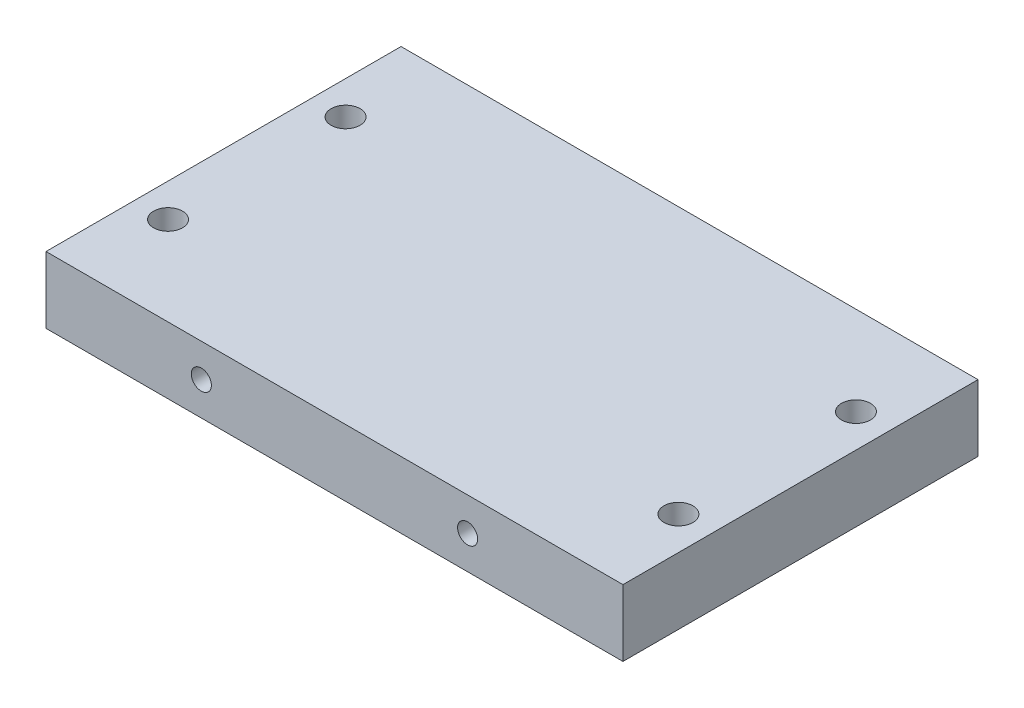
ISO-10303-21;
HEADER;
FILE_DESCRIPTION(('STEP AP214'),'2;1');
FILE_NAME('part.step','',(''),(''),'','','');
FILE_SCHEMA(('AUTOMOTIVE_DESIGN { 1 0 10303 214 1 1 1 1 }'));
ENDSEC;
DATA;
#1=APPLICATION_CONTEXT('core data for automotive mechanical design processes');
#2=APPLICATION_PROTOCOL_DEFINITION('international standard','automotive_design',2000,#1);
#3=PRODUCT_CONTEXT('',#1,'mechanical');
#4=PRODUCT('Part','Part','',(#3));
#5=PRODUCT_RELATED_PRODUCT_CATEGORY('part','',(#4));
#6=PRODUCT_DEFINITION_FORMATION('','',#4);
#7=PRODUCT_DEFINITION_CONTEXT('part definition',#1,'design');
#8=PRODUCT_DEFINITION('design','',#6,#7);
#9=PRODUCT_DEFINITION_SHAPE('','',#8);
#10=(LENGTH_UNIT() NAMED_UNIT(*) SI_UNIT(.MILLI.,.METRE.));
#11=(NAMED_UNIT(*) PLANE_ANGLE_UNIT() SI_UNIT($,.RADIAN.));
#12=(NAMED_UNIT(*) SI_UNIT($,.STERADIAN.) SOLID_ANGLE_UNIT());
#13=UNCERTAINTY_MEASURE_WITH_UNIT(LENGTH_MEASURE(1.E-05),#10,'distance_accuracy_value','');
#14=(GEOMETRIC_REPRESENTATION_CONTEXT(3) GLOBAL_UNCERTAINTY_ASSIGNED_CONTEXT((#13)) GLOBAL_UNIT_ASSIGNED_CONTEXT((#10,
#11,#12)) REPRESENTATION_CONTEXT('',''));
#15=CARTESIAN_POINT('',(0.,0.,0.));
#16=DIRECTION('',(0.,0.,1.));
#17=DIRECTION('',(1.,0.,0.));
#18=AXIS2_PLACEMENT_3D('',#15,#16,#17);
#19=CARTESIAN_POINT('',(-32.5,7.5,20.));
#20=DIRECTION('',(1.,0.,0.));
#21=DIRECTION('',(0.,0.,-1.));
#22=AXIS2_PLACEMENT_3D('',#19,#20,#21);
#23=PLANE('',#22);
#24=DIRECTION('',(0.,0.,1.));
#25=VECTOR('',#24,1.);
#26=CARTESIAN_POINT('',(-32.5,0.,20.));
#27=LINE('',#26,#25);
#28=CARTESIAN_POINT('',(-32.5,0.,-20.));
#29=VERTEX_POINT('',#28);
#30=CARTESIAN_POINT('',(-32.5,0.,20.));
#31=VERTEX_POINT('',#30);
#32=EDGE_CURVE('E135',#29,#31,#27,.T.);
#33=ORIENTED_EDGE('',*,*,#32,.T.);
#34=DIRECTION('',(0.,-1.,0.));
#35=VECTOR('',#34,1.);
#36=CARTESIAN_POINT('',(-32.5,7.5,20.));
#37=LINE('',#36,#35);
#38=CARTESIAN_POINT('',(-32.5,7.5,20.));
#39=VERTEX_POINT('',#38);
#40=EDGE_CURVE('E11',#39,#31,#37,.T.);
#41=ORIENTED_EDGE('',*,*,#40,.F.);
#42=DIRECTION('',(0.,0.,1.));
#43=VECTOR('',#42,1.);
#44=CARTESIAN_POINT('',(-32.5,7.5,20.));
#45=LINE('',#44,#43);
#46=CARTESIAN_POINT('',(-32.5,7.5,-20.));
#47=VERTEX_POINT('',#46);
#48=EDGE_CURVE('E136',#47,#39,#45,.T.);
#49=ORIENTED_EDGE('',*,*,#48,.F.);
#50=DIRECTION('',(0.,-1.,0.));
#51=VECTOR('',#50,1.);
#52=CARTESIAN_POINT('',(-32.5,7.5,-20.));
#53=LINE('',#52,#51);
#54=EDGE_CURVE('E142',#47,#29,#53,.T.);
#55=ORIENTED_EDGE('',*,*,#54,.T.);
#56=EDGE_LOOP('',(#33,#41,#49,#55));
#57=FACE_BOUND('',#56,.T.);
#58=ADVANCED_FACE('F40',(#57),#23,.F.);
#59=CARTESIAN_POINT('',(32.5,7.5,20.));
#60=DIRECTION('',(0.,0.,-1.));
#61=DIRECTION('',(-1.,0.,0.));
#62=AXIS2_PLACEMENT_3D('',#59,#60,#61);
#63=PLANE('',#62);
#64=CARTESIAN_POINT('',(-15.,3.75,20.));
#65=DIRECTION('',(0.,0.,1.));
#66=DIRECTION('',(1.,0.,0.));
#67=AXIS2_PLACEMENT_3D('',#64,#65,#66);
#68=CIRCLE('',#67,1.13029999999999);
#69=CARTESIAN_POINT('',(-13.8697,3.75,20.));
#70=VERTEX_POINT('',#69);
#71=EDGE_CURVE('E123',#70,#70,#68,.T.);
#72=ORIENTED_EDGE('',*,*,#71,.F.);
#73=EDGE_LOOP('',(#72));
#74=FACE_BOUND('',#73,.T.);
#75=CARTESIAN_POINT('',(15.,3.75,20.));
#76=DIRECTION('',(0.,0.,1.));
#77=DIRECTION('',(1.,0.,0.));
#78=AXIS2_PLACEMENT_3D('',#75,#76,#77);
#79=CIRCLE('',#78,1.13029999999999);
#80=CARTESIAN_POINT('',(16.1303,3.75,20.));
#81=VERTEX_POINT('',#80);
#82=EDGE_CURVE('E129',#81,#81,#79,.T.);
#83=ORIENTED_EDGE('',*,*,#82,.F.);
#84=EDGE_LOOP('',(#83));
#85=FACE_BOUND('',#84,.T.);
#86=DIRECTION('',(1.,0.,0.));
#87=VECTOR('',#86,1.);
#88=CARTESIAN_POINT('',(32.5,0.,20.));
#89=LINE('',#88,#87);
#90=CARTESIAN_POINT('',(32.5,0.,20.));
#91=VERTEX_POINT('',#90);
#92=EDGE_CURVE('E145',#31,#91,#89,.T.);
#93=ORIENTED_EDGE('',*,*,#92,.T.);
#94=DIRECTION('',(0.,-1.,0.));
#95=VECTOR('',#94,1.);
#96=CARTESIAN_POINT('',(32.5,7.5,20.));
#97=LINE('',#96,#95);
#98=CARTESIAN_POINT('',(32.5,7.5,20.));
#99=VERTEX_POINT('',#98);
#100=EDGE_CURVE('E48',#99,#91,#97,.T.);
#101=ORIENTED_EDGE('',*,*,#100,.F.);
#102=DIRECTION('',(1.,0.,0.));
#103=VECTOR('',#102,1.);
#104=CARTESIAN_POINT('',(32.5,7.5,20.));
#105=LINE('',#104,#103);
#106=EDGE_CURVE('E87',#39,#99,#105,.T.);
#107=ORIENTED_EDGE('',*,*,#106,.F.);
#108=ORIENTED_EDGE('',*,*,#40,.T.);
#109=EDGE_LOOP('',(#93,#101,#107,#108));
#110=FACE_BOUND('',#109,.T.);
#111=ADVANCED_FACE('F170',(#74,#85,#110),#63,.F.);
#112=CARTESIAN_POINT('',(32.5,7.5,20.));
#113=DIRECTION('',(-1.,0.,0.));
#114=DIRECTION('',(0.,0.,1.));
#115=AXIS2_PLACEMENT_3D('',#112,#113,#114);
#116=PLANE('',#115);
#117=DIRECTION('',(0.,0.,-1.));
#118=VECTOR('',#117,1.);
#119=CARTESIAN_POINT('',(32.5,0.,20.));
#120=LINE('',#119,#118);
#121=CARTESIAN_POINT('',(32.5,0.,-20.));
#122=VERTEX_POINT('',#121);
#123=EDGE_CURVE('E74',#91,#122,#120,.T.);
#124=ORIENTED_EDGE('',*,*,#123,.T.);
#125=DIRECTION('',(0.,-1.,0.));
#126=VECTOR('',#125,1.);
#127=CARTESIAN_POINT('',(32.5,7.5,-20.));
#128=LINE('',#127,#126);
#129=CARTESIAN_POINT('',(32.5,7.5,-20.));
#130=VERTEX_POINT('',#129);
#131=EDGE_CURVE('E150',#130,#122,#128,.T.);
#132=ORIENTED_EDGE('',*,*,#131,.F.);
#133=DIRECTION('',(0.,0.,-1.));
#134=VECTOR('',#133,1.);
#135=CARTESIAN_POINT('',(32.5,7.5,20.));
#136=LINE('',#135,#134);
#137=EDGE_CURVE('E139',#99,#130,#136,.T.);
#138=ORIENTED_EDGE('',*,*,#137,.F.);
#139=ORIENTED_EDGE('',*,*,#100,.T.);
#140=EDGE_LOOP('',(#124,#132,#138,#139));
#141=FACE_BOUND('',#140,.T.);
#142=ADVANCED_FACE('F152',(#141),#116,.F.);
#143=CARTESIAN_POINT('',(32.5,7.5,-20.));
#144=DIRECTION('',(0.,0.,1.));
#145=DIRECTION('',(1.,0.,0.));
#146=AXIS2_PLACEMENT_3D('',#143,#144,#145);
#147=PLANE('',#146);
#148=CARTESIAN_POINT('',(15.,3.75,-20.));
#149=DIRECTION('',(0.,0.,-1.));
#150=DIRECTION('',(-1.,0.,0.));
#151=AXIS2_PLACEMENT_3D('',#148,#149,#150);
#152=CIRCLE('',#151,1.13029999999999);
#153=CARTESIAN_POINT('',(13.8697,3.75,-20.));
#154=VERTEX_POINT('',#153);
#155=EDGE_CURVE('E111',#154,#154,#152,.T.);
#156=ORIENTED_EDGE('',*,*,#155,.F.);
#157=EDGE_LOOP('',(#156));
#158=FACE_BOUND('',#157,.T.);
#159=CARTESIAN_POINT('',(-15.,3.75,-20.));
#160=DIRECTION('',(0.,0.,-1.));
#161=DIRECTION('',(-1.,0.,0.));
#162=AXIS2_PLACEMENT_3D('',#159,#160,#161);
#163=CIRCLE('',#162,1.13029999999999);
#164=CARTESIAN_POINT('',(-16.1303,3.75,-20.));
#165=VERTEX_POINT('',#164);
#166=EDGE_CURVE('E110',#165,#165,#163,.T.);
#167=ORIENTED_EDGE('',*,*,#166,.F.);
#168=EDGE_LOOP('',(#167));
#169=FACE_BOUND('',#168,.T.);
#170=DIRECTION('',(-1.,0.,0.));
#171=VECTOR('',#170,1.);
#172=CARTESIAN_POINT('',(32.5,0.,-20.));
#173=LINE('',#172,#171);
#174=EDGE_CURVE('E80',#122,#29,#173,.T.);
#175=ORIENTED_EDGE('',*,*,#174,.T.);
#176=ORIENTED_EDGE('',*,*,#54,.F.);
#177=DIRECTION('',(-1.,0.,0.));
#178=VECTOR('',#177,1.);
#179=CARTESIAN_POINT('',(32.5,7.5,-20.));
#180=LINE('',#179,#178);
#181=EDGE_CURVE('E56',#130,#47,#180,.T.);
#182=ORIENTED_EDGE('',*,*,#181,.F.);
#183=ORIENTED_EDGE('',*,*,#131,.T.);
#184=EDGE_LOOP('',(#175,#176,#182,#183));
#185=FACE_BOUND('',#184,.T.);
#186=ADVANCED_FACE('F159',(#158,#169,#185),#147,.F.);
#187=CARTESIAN_POINT('',(0.,7.5,0.));
#188=DIRECTION('',(0.,1.,0.));
#189=DIRECTION('',(0.,0.,1.));
#190=AXIS2_PLACEMENT_3D('',#187,#188,#189);
#191=PLANE('',#190);
#192=CARTESIAN_POINT('',(28.75,7.5,9.99999999999999));
#193=DIRECTION('',(0.,-1.,0.));
#194=DIRECTION('',(0.,0.,-1.));
#195=AXIS2_PLACEMENT_3D('',#192,#193,#194);
#196=CIRCLE('',#195,1.63195);
#197=CARTESIAN_POINT('',(28.75,7.5,8.36805));
#198=VERTEX_POINT('',#197);
#199=EDGE_CURVE('E409',#198,#198,#196,.T.);
#200=ORIENTED_EDGE('',*,*,#199,.T.);
#201=EDGE_LOOP('',(#200));
#202=FACE_BOUND('',#201,.T.);
#203=CARTESIAN_POINT('',(28.75,7.5,-10.));
#204=DIRECTION('',(0.,-1.,0.));
#205=DIRECTION('',(0.,0.,-1.));
#206=AXIS2_PLACEMENT_3D('',#203,#204,#205);
#207=CIRCLE('',#206,1.63195);
#208=CARTESIAN_POINT('',(28.75,7.5,-11.63195));
#209=VERTEX_POINT('',#208);
#210=EDGE_CURVE('E419',#209,#209,#207,.T.);
#211=ORIENTED_EDGE('',*,*,#210,.T.);
#212=EDGE_LOOP('',(#211));
#213=FACE_BOUND('',#212,.T.);
#214=CARTESIAN_POINT('',(-28.75,7.5,-10.));
#215=DIRECTION('',(0.,-1.,0.));
#216=DIRECTION('',(0.,0.,-1.));
#217=AXIS2_PLACEMENT_3D('',#214,#215,#216);
#218=CIRCLE('',#217,1.63195);
#219=CARTESIAN_POINT('',(-28.75,7.5,-11.63195));
#220=VERTEX_POINT('',#219);
#221=EDGE_CURVE('E224',#220,#220,#218,.T.);
#222=ORIENTED_EDGE('',*,*,#221,.T.);
#223=EDGE_LOOP('',(#222));
#224=FACE_BOUND('',#223,.T.);
#225=CARTESIAN_POINT('',(-28.75,7.5,10.));
#226=DIRECTION('',(0.,-1.,0.));
#227=DIRECTION('',(0.,0.,-1.));
#228=AXIS2_PLACEMENT_3D('',#225,#226,#227);
#229=CIRCLE('',#228,1.63195);
#230=CARTESIAN_POINT('',(-28.75,7.5,8.36805000000001));
#231=VERTEX_POINT('',#230);
#232=EDGE_CURVE('E117',#231,#231,#229,.T.);
#233=ORIENTED_EDGE('',*,*,#232,.T.);
#234=EDGE_LOOP('',(#233));
#235=FACE_BOUND('',#234,.T.);
#236=ORIENTED_EDGE('',*,*,#48,.T.);
#237=ORIENTED_EDGE('',*,*,#106,.T.);
#238=ORIENTED_EDGE('',*,*,#137,.T.);
#239=ORIENTED_EDGE('',*,*,#181,.T.);
#240=EDGE_LOOP('',(#236,#237,#238,#239));
#241=FACE_BOUND('',#240,.T.);
#242=ADVANCED_FACE('F161',(#202,#213,#224,#235,#241),#191,.T.);
#243=CARTESIAN_POINT('',(0.,0.,0.));
#244=DIRECTION('',(0.,1.,0.));
#245=DIRECTION('',(0.,0.,1.));
#246=AXIS2_PLACEMENT_3D('',#243,#244,#245);
#247=PLANE('',#246);
#248=CARTESIAN_POINT('',(28.75,0.,9.99999999999999));
#249=DIRECTION('',(0.,-1.,0.));
#250=DIRECTION('',(0.,0.,-1.));
#251=AXIS2_PLACEMENT_3D('',#248,#249,#250);
#252=CIRCLE('',#251,2.77876);
#253=CARTESIAN_POINT('',(28.75,0.,7.22124));
#254=VERTEX_POINT('',#253);
#255=EDGE_CURVE('E210',#254,#254,#252,.T.);
#256=ORIENTED_EDGE('',*,*,#255,.F.);
#257=EDGE_LOOP('',(#256));
#258=FACE_BOUND('',#257,.T.);
#259=CARTESIAN_POINT('',(28.75,0.,-10.));
#260=DIRECTION('',(0.,-1.,0.));
#261=DIRECTION('',(0.,0.,-1.));
#262=AXIS2_PLACEMENT_3D('',#259,#260,#261);
#263=CIRCLE('',#262,2.77876);
#264=CARTESIAN_POINT('',(28.75,0.,-12.77876));
#265=VERTEX_POINT('',#264);
#266=EDGE_CURVE('E214',#265,#265,#263,.T.);
#267=ORIENTED_EDGE('',*,*,#266,.F.);
#268=EDGE_LOOP('',(#267));
#269=FACE_BOUND('',#268,.T.);
#270=CARTESIAN_POINT('',(-28.75,0.,-10.));
#271=DIRECTION('',(0.,-1.,0.));
#272=DIRECTION('',(0.,0.,-1.));
#273=AXIS2_PLACEMENT_3D('',#270,#271,#272);
#274=CIRCLE('',#273,2.77876);
#275=CARTESIAN_POINT('',(-28.75,0.,-12.77876));
#276=VERTEX_POINT('',#275);
#277=EDGE_CURVE('E218',#276,#276,#274,.T.);
#278=ORIENTED_EDGE('',*,*,#277,.F.);
#279=EDGE_LOOP('',(#278));
#280=FACE_BOUND('',#279,.T.);
#281=CARTESIAN_POINT('',(-28.75,0.,10.));
#282=DIRECTION('',(0.,-1.,0.));
#283=DIRECTION('',(0.,0.,-1.));
#284=AXIS2_PLACEMENT_3D('',#281,#282,#283);
#285=CIRCLE('',#284,2.77876);
#286=CARTESIAN_POINT('',(-28.75,0.,7.22124));
#287=VERTEX_POINT('',#286);
#288=EDGE_CURVE('E221',#287,#287,#285,.T.);
#289=ORIENTED_EDGE('',*,*,#288,.F.);
#290=EDGE_LOOP('',(#289));
#291=FACE_BOUND('',#290,.T.);
#292=ORIENTED_EDGE('',*,*,#32,.F.);
#293=ORIENTED_EDGE('',*,*,#174,.F.);
#294=ORIENTED_EDGE('',*,*,#123,.F.);
#295=ORIENTED_EDGE('',*,*,#92,.F.);
#296=EDGE_LOOP('',(#292,#293,#294,#295));
#297=FACE_BOUND('',#296,.T.);
#298=ADVANCED_FACE('F155',(#258,#269,#280,#291,#297),#247,.F.);
#299=CARTESIAN_POINT('',(15.,3.75,12.4));
#300=DIRECTION('',(0.,0.,1.));
#301=DIRECTION('',(1.,0.,0.));
#302=AXIS2_PLACEMENT_3D('',#299,#300,#301);
#303=CONICAL_SURFACE('',#302,1.13029999999999,1.02974425867665);
#304=CARTESIAN_POINT('',(15.,3.75,11.7208472423132));
#305=VERTEX_POINT('',#304);
#306=VERTEX_LOOP('',#305);
#307=FACE_BOUND('',#306,.T.);
#308=CARTESIAN_POINT('',(15.,3.75,12.4));
#309=DIRECTION('',(0.,0.,1.));
#310=DIRECTION('',(1.,0.,0.));
#311=AXIS2_PLACEMENT_3D('',#308,#309,#310);
#312=CIRCLE('',#311,1.13029999999999);
#313=CARTESIAN_POINT('',(16.1303,3.75,12.4));
#314=VERTEX_POINT('',#313);
#315=EDGE_CURVE('E132',#314,#314,#312,.T.);
#316=ORIENTED_EDGE('',*,*,#315,.T.);
#317=EDGE_LOOP('',(#316));
#318=FACE_BOUND('',#317,.T.);
#319=ADVANCED_FACE('F189',(#307,#318),#303,.F.);
#320=CARTESIAN_POINT('',(15.,3.75,20.));
#321=DIRECTION('',(0.,0.,1.));
#322=DIRECTION('',(1.,0.,0.));
#323=AXIS2_PLACEMENT_3D('',#320,#321,#322);
#324=CYLINDRICAL_SURFACE('',#323,1.13029999999999);
#325=ORIENTED_EDGE('',*,*,#315,.F.);
#326=EDGE_LOOP('',(#325));
#327=FACE_BOUND('',#326,.T.);
#328=ORIENTED_EDGE('',*,*,#82,.T.);
#329=EDGE_LOOP('',(#328));
#330=FACE_BOUND('',#329,.T.);
#331=ADVANCED_FACE('F186',(#327,#330),#324,.F.);
#332=CARTESIAN_POINT('',(-15.,3.75,12.4));
#333=DIRECTION('',(0.,0.,1.));
#334=DIRECTION('',(1.,0.,0.));
#335=AXIS2_PLACEMENT_3D('',#332,#333,#334);
#336=CONICAL_SURFACE('',#335,1.13029999999999,1.02974425867665);
#337=CARTESIAN_POINT('',(-15.,3.75,11.7208472423132));
#338=VERTEX_POINT('',#337);
#339=VERTEX_LOOP('',#338);
#340=FACE_BOUND('',#339,.T.);
#341=CARTESIAN_POINT('',(-15.,3.75,12.4));
#342=DIRECTION('',(0.,0.,1.));
#343=DIRECTION('',(1.,0.,0.));
#344=AXIS2_PLACEMENT_3D('',#341,#342,#343);
#345=CIRCLE('',#344,1.13029999999999);
#346=CARTESIAN_POINT('',(-13.8697,3.75,12.4));
#347=VERTEX_POINT('',#346);
#348=EDGE_CURVE('E126',#347,#347,#345,.T.);
#349=ORIENTED_EDGE('',*,*,#348,.T.);
#350=EDGE_LOOP('',(#349));
#351=FACE_BOUND('',#350,.T.);
#352=ADVANCED_FACE('F188',(#340,#351),#336,.F.);
#353=CARTESIAN_POINT('',(-15.,3.75,20.));
#354=DIRECTION('',(0.,0.,1.));
#355=DIRECTION('',(1.,0.,0.));
#356=AXIS2_PLACEMENT_3D('',#353,#354,#355);
#357=CYLINDRICAL_SURFACE('',#356,1.13029999999999);
#358=ORIENTED_EDGE('',*,*,#348,.F.);
#359=EDGE_LOOP('',(#358));
#360=FACE_BOUND('',#359,.T.);
#361=ORIENTED_EDGE('',*,*,#71,.T.);
#362=EDGE_LOOP('',(#361));
#363=FACE_BOUND('',#362,.T.);
#364=ADVANCED_FACE('F196',(#360,#363),#357,.F.);
#365=CARTESIAN_POINT('',(-15.,3.75,-12.4));
#366=DIRECTION('',(0.,0.,-1.));
#367=DIRECTION('',(-1.,0.,0.));
#368=AXIS2_PLACEMENT_3D('',#365,#366,#367);
#369=CONICAL_SURFACE('',#368,1.13029999999999,1.02974425867665);
#370=CARTESIAN_POINT('',(-15.,3.75,-11.7208472423132));
#371=VERTEX_POINT('',#370);
#372=VERTEX_LOOP('',#371);
#373=FACE_BOUND('',#372,.T.);
#374=CARTESIAN_POINT('',(-15.,3.75,-12.4));
#375=DIRECTION('',(0.,0.,-1.));
#376=DIRECTION('',(-1.,0.,0.));
#377=AXIS2_PLACEMENT_3D('',#374,#375,#376);
#378=CIRCLE('',#377,1.13029999999999);
#379=CARTESIAN_POINT('',(-16.1303,3.75,-12.4));
#380=VERTEX_POINT('',#379);
#381=EDGE_CURVE('E114',#380,#380,#378,.T.);
#382=ORIENTED_EDGE('',*,*,#381,.T.);
#383=EDGE_LOOP('',(#382));
#384=FACE_BOUND('',#383,.T.);
#385=ADVANCED_FACE('F267',(#373,#384),#369,.F.);
#386=CARTESIAN_POINT('',(-15.,3.75,-20.));
#387=DIRECTION('',(0.,0.,-1.));
#388=DIRECTION('',(-1.,0.,0.));
#389=AXIS2_PLACEMENT_3D('',#386,#387,#388);
#390=CYLINDRICAL_SURFACE('',#389,1.13029999999999);
#391=ORIENTED_EDGE('',*,*,#381,.F.);
#392=EDGE_LOOP('',(#391));
#393=FACE_BOUND('',#392,.T.);
#394=ORIENTED_EDGE('',*,*,#166,.T.);
#395=EDGE_LOOP('',(#394));
#396=FACE_BOUND('',#395,.T.);
#397=ADVANCED_FACE('F104',(#393,#396),#390,.F.);
#398=CARTESIAN_POINT('',(15.,3.75,-12.4));
#399=DIRECTION('',(0.,0.,-1.));
#400=DIRECTION('',(-1.,0.,0.));
#401=AXIS2_PLACEMENT_3D('',#398,#399,#400);
#402=CONICAL_SURFACE('',#401,1.13029999999999,1.02974425867665);
#403=CARTESIAN_POINT('',(15.,3.75,-11.7208472423132));
#404=VERTEX_POINT('',#403);
#405=VERTEX_LOOP('',#404);
#406=FACE_BOUND('',#405,.T.);
#407=CARTESIAN_POINT('',(15.,3.75,-12.4));
#408=DIRECTION('',(0.,0.,-1.));
#409=DIRECTION('',(-1.,0.,0.));
#410=AXIS2_PLACEMENT_3D('',#407,#408,#409);
#411=CIRCLE('',#410,1.13029999999999);
#412=CARTESIAN_POINT('',(13.8697,3.75,-12.4));
#413=VERTEX_POINT('',#412);
#414=EDGE_CURVE('E108',#413,#413,#411,.T.);
#415=ORIENTED_EDGE('',*,*,#414,.T.);
#416=EDGE_LOOP('',(#415));
#417=FACE_BOUND('',#416,.T.);
#418=ADVANCED_FACE('F100',(#406,#417),#402,.F.);
#419=CARTESIAN_POINT('',(15.,3.75,-20.));
#420=DIRECTION('',(0.,0.,-1.));
#421=DIRECTION('',(-1.,0.,0.));
#422=AXIS2_PLACEMENT_3D('',#419,#420,#421);
#423=CYLINDRICAL_SURFACE('',#422,1.13029999999999);
#424=ORIENTED_EDGE('',*,*,#414,.F.);
#425=EDGE_LOOP('',(#424));
#426=FACE_BOUND('',#425,.T.);
#427=ORIENTED_EDGE('',*,*,#155,.T.);
#428=EDGE_LOOP('',(#427));
#429=FACE_BOUND('',#428,.T.);
#430=ADVANCED_FACE('F103',(#426,#429),#423,.F.);
#431=CARTESIAN_POINT('',(-28.75,0.,10.));
#432=DIRECTION('',(0.,-1.,0.));
#433=DIRECTION('',(0.,0.,-1.));
#434=AXIS2_PLACEMENT_3D('',#431,#432,#433);
#435=CYLINDRICAL_SURFACE('',#434,1.63195);
#436=ORIENTED_EDGE('',*,*,#232,.F.);
#437=EDGE_LOOP('',(#436));
#438=FACE_BOUND('',#437,.T.);
#439=CARTESIAN_POINT('',(-28.75,2.8448,10.));
#440=DIRECTION('',(0.,-1.,0.));
#441=DIRECTION('',(0.,0.,-1.));
#442=AXIS2_PLACEMENT_3D('',#439,#440,#441);
#443=CIRCLE('',#442,1.63195);
#444=CARTESIAN_POINT('',(-28.75,2.8448,8.36805));
#445=VERTEX_POINT('',#444);
#446=EDGE_CURVE('E227',#445,#445,#443,.T.);
#447=ORIENTED_EDGE('',*,*,#446,.T.);
#448=EDGE_LOOP('',(#447));
#449=FACE_BOUND('',#448,.T.);
#450=ADVANCED_FACE('F239',(#438,#449),#435,.F.);
#451=CARTESIAN_POINT('',(-27.11805,2.8448,10.));
#452=DIRECTION('',(0.,1.,0.));
#453=DIRECTION('',(0.,0.,1.));
#454=AXIS2_PLACEMENT_3D('',#451,#452,#453);
#455=PLANE('',#454);
#456=ORIENTED_EDGE('',*,*,#446,.F.);
#457=EDGE_LOOP('',(#456));
#458=FACE_BOUND('',#457,.T.);
#459=CARTESIAN_POINT('',(-28.75,2.8448,10.));
#460=DIRECTION('',(0.,-1.,0.));
#461=DIRECTION('',(0.,0.,-1.));
#462=AXIS2_PLACEMENT_3D('',#459,#460,#461);
#463=CIRCLE('',#462,2.77876);
#464=CARTESIAN_POINT('',(-28.75,2.8448,7.22124));
#465=VERTEX_POINT('',#464);
#466=EDGE_CURVE('E223',#465,#465,#463,.T.);
#467=ORIENTED_EDGE('',*,*,#466,.T.);
#468=EDGE_LOOP('',(#467));
#469=FACE_BOUND('',#468,.T.);
#470=ADVANCED_FACE('F242',(#458,#469),#455,.F.);
#471=CARTESIAN_POINT('',(-28.75,0.,10.));
#472=DIRECTION('',(0.,-1.,0.));
#473=DIRECTION('',(0.,0.,-1.));
#474=AXIS2_PLACEMENT_3D('',#471,#472,#473);
#475=CYLINDRICAL_SURFACE('',#474,2.77876);
#476=ORIENTED_EDGE('',*,*,#466,.F.);
#477=EDGE_LOOP('',(#476));
#478=FACE_BOUND('',#477,.T.);
#479=ORIENTED_EDGE('',*,*,#288,.T.);
#480=EDGE_LOOP('',(#479));
#481=FACE_BOUND('',#480,.T.);
#482=ADVANCED_FACE('F248',(#478,#481),#475,.F.);
#483=CARTESIAN_POINT('',(-28.75,0.,-10.));
#484=DIRECTION('',(0.,-1.,0.));
#485=DIRECTION('',(0.,0.,-1.));
#486=AXIS2_PLACEMENT_3D('',#483,#484,#485);
#487=CYLINDRICAL_SURFACE('',#486,1.63195);
#488=ORIENTED_EDGE('',*,*,#221,.F.);
#489=EDGE_LOOP('',(#488));
#490=FACE_BOUND('',#489,.T.);
#491=CARTESIAN_POINT('',(-28.75,2.8448,-10.));
#492=DIRECTION('',(0.,-1.,0.));
#493=DIRECTION('',(0.,0.,-1.));
#494=AXIS2_PLACEMENT_3D('',#491,#492,#493);
#495=CIRCLE('',#494,1.63195);
#496=CARTESIAN_POINT('',(-28.75,2.8448,-11.63195));
#497=VERTEX_POINT('',#496);
#498=EDGE_CURVE('E230',#497,#497,#495,.T.);
#499=ORIENTED_EDGE('',*,*,#498,.T.);
#500=EDGE_LOOP('',(#499));
#501=FACE_BOUND('',#500,.T.);
#502=ADVANCED_FACE('F253',(#490,#501),#487,.F.);
#503=CARTESIAN_POINT('',(-27.11805,2.8448,-10.));
#504=DIRECTION('',(0.,1.,0.));
#505=DIRECTION('',(0.,0.,1.));
#506=AXIS2_PLACEMENT_3D('',#503,#504,#505);
#507=PLANE('',#506);
#508=ORIENTED_EDGE('',*,*,#498,.F.);
#509=EDGE_LOOP('',(#508));
#510=FACE_BOUND('',#509,.T.);
#511=CARTESIAN_POINT('',(-28.75,2.8448,-10.));
#512=DIRECTION('',(0.,-1.,0.));
#513=DIRECTION('',(0.,0.,-1.));
#514=AXIS2_PLACEMENT_3D('',#511,#512,#513);
#515=CIRCLE('',#514,2.77876);
#516=CARTESIAN_POINT('',(-28.75,2.8448,-12.77876));
#517=VERTEX_POINT('',#516);
#518=EDGE_CURVE('E423',#517,#517,#515,.T.);
#519=ORIENTED_EDGE('',*,*,#518,.T.);
#520=EDGE_LOOP('',(#519));
#521=FACE_BOUND('',#520,.T.);
#522=ADVANCED_FACE('F258',(#510,#521),#507,.F.);
#523=CARTESIAN_POINT('',(-28.75,0.,-10.));
#524=DIRECTION('',(0.,-1.,0.));
#525=DIRECTION('',(0.,0.,-1.));
#526=AXIS2_PLACEMENT_3D('',#523,#524,#525);
#527=CYLINDRICAL_SURFACE('',#526,2.77876);
#528=ORIENTED_EDGE('',*,*,#518,.F.);
#529=EDGE_LOOP('',(#528));
#530=FACE_BOUND('',#529,.T.);
#531=ORIENTED_EDGE('',*,*,#277,.T.);
#532=EDGE_LOOP('',(#531));
#533=FACE_BOUND('',#532,.T.);
#534=ADVANCED_FACE('F326',(#530,#533),#527,.F.);
#535=CARTESIAN_POINT('',(28.75,0.,-10.));
#536=DIRECTION('',(0.,-1.,0.));
#537=DIRECTION('',(0.,0.,-1.));
#538=AXIS2_PLACEMENT_3D('',#535,#536,#537);
#539=CYLINDRICAL_SURFACE('',#538,1.63195);
#540=ORIENTED_EDGE('',*,*,#210,.F.);
#541=EDGE_LOOP('',(#540));
#542=FACE_BOUND('',#541,.T.);
#543=CARTESIAN_POINT('',(28.75,2.8448,-10.));
#544=DIRECTION('',(0.,-1.,0.));
#545=DIRECTION('',(0.,0.,-1.));
#546=AXIS2_PLACEMENT_3D('',#543,#544,#545);
#547=CIRCLE('',#546,1.63195);
#548=CARTESIAN_POINT('',(28.75,2.8448,-11.63195));
#549=VERTEX_POINT('',#548);
#550=EDGE_CURVE('E416',#549,#549,#547,.T.);
#551=ORIENTED_EDGE('',*,*,#550,.T.);
#552=EDGE_LOOP('',(#551));
#553=FACE_BOUND('',#552,.T.);
#554=ADVANCED_FACE('F335',(#542,#553),#539,.F.);
#555=CARTESIAN_POINT('',(30.38195,2.8448,-10.));
#556=DIRECTION('',(0.,1.,0.));
#557=DIRECTION('',(0.,0.,1.));
#558=AXIS2_PLACEMENT_3D('',#555,#556,#557);
#559=PLANE('',#558);
#560=ORIENTED_EDGE('',*,*,#550,.F.);
#561=EDGE_LOOP('',(#560));
#562=FACE_BOUND('',#561,.T.);
#563=CARTESIAN_POINT('',(28.75,2.8448,-10.));
#564=DIRECTION('',(0.,-1.,0.));
#565=DIRECTION('',(0.,0.,-1.));
#566=AXIS2_PLACEMENT_3D('',#563,#564,#565);
#567=CIRCLE('',#566,2.77876);
#568=CARTESIAN_POINT('',(28.75,2.8448,-12.77876));
#569=VERTEX_POINT('',#568);
#570=EDGE_CURVE('E413',#569,#569,#567,.T.);
#571=ORIENTED_EDGE('',*,*,#570,.T.);
#572=EDGE_LOOP('',(#571));
#573=FACE_BOUND('',#572,.T.);
#574=ADVANCED_FACE('F345',(#562,#573),#559,.F.);
#575=CARTESIAN_POINT('',(28.75,0.,-10.));
#576=DIRECTION('',(0.,-1.,0.));
#577=DIRECTION('',(0.,0.,-1.));
#578=AXIS2_PLACEMENT_3D('',#575,#576,#577);
#579=CYLINDRICAL_SURFACE('',#578,2.77876);
#580=ORIENTED_EDGE('',*,*,#570,.F.);
#581=EDGE_LOOP('',(#580));
#582=FACE_BOUND('',#581,.T.);
#583=ORIENTED_EDGE('',*,*,#266,.T.);
#584=EDGE_LOOP('',(#583));
#585=FACE_BOUND('',#584,.T.);
#586=ADVANCED_FACE('F355',(#582,#585),#579,.F.);
#587=CARTESIAN_POINT('',(28.75,0.,9.99999999999999));
#588=DIRECTION('',(0.,-1.,0.));
#589=DIRECTION('',(0.,0.,-1.));
#590=AXIS2_PLACEMENT_3D('',#587,#588,#589);
#591=CYLINDRICAL_SURFACE('',#590,1.63195);
#592=ORIENTED_EDGE('',*,*,#199,.F.);
#593=EDGE_LOOP('',(#592));
#594=FACE_BOUND('',#593,.T.);
#595=CARTESIAN_POINT('',(28.75,2.8448,9.99999999999999));
#596=DIRECTION('',(0.,-1.,0.));
#597=DIRECTION('',(0.,0.,-1.));
#598=AXIS2_PLACEMENT_3D('',#595,#596,#597);
#599=CIRCLE('',#598,1.63195);
#600=CARTESIAN_POINT('',(28.75,2.8448,8.36804999999999));
#601=VERTEX_POINT('',#600);
#602=EDGE_CURVE('E404',#601,#601,#599,.T.);
#603=ORIENTED_EDGE('',*,*,#602,.T.);
#604=EDGE_LOOP('',(#603));
#605=FACE_BOUND('',#604,.T.);
#606=ADVANCED_FACE('F365',(#594,#605),#591,.F.);
#607=CARTESIAN_POINT('',(30.38195,2.8448,9.99999999999999));
#608=DIRECTION('',(0.,1.,0.));
#609=DIRECTION('',(0.,0.,1.));
#610=AXIS2_PLACEMENT_3D('',#607,#608,#609);
#611=PLANE('',#610);
#612=ORIENTED_EDGE('',*,*,#602,.F.);
#613=EDGE_LOOP('',(#612));
#614=FACE_BOUND('',#613,.T.);
#615=CARTESIAN_POINT('',(28.75,2.8448,9.99999999999999));
#616=DIRECTION('',(0.,-1.,0.));
#617=DIRECTION('',(0.,0.,-1.));
#618=AXIS2_PLACEMENT_3D('',#615,#616,#617);
#619=CIRCLE('',#618,2.77876);
#620=CARTESIAN_POINT('',(28.75,2.8448,7.22124));
#621=VERTEX_POINT('',#620);
#622=EDGE_CURVE('E402',#621,#621,#619,.T.);
#623=ORIENTED_EDGE('',*,*,#622,.T.);
#624=EDGE_LOOP('',(#623));
#625=FACE_BOUND('',#624,.T.);
#626=ADVANCED_FACE('F375',(#614,#625),#611,.F.);
#627=CARTESIAN_POINT('',(28.75,0.,9.99999999999999));
#628=DIRECTION('',(0.,-1.,0.));
#629=DIRECTION('',(0.,0.,-1.));
#630=AXIS2_PLACEMENT_3D('',#627,#628,#629);
#631=CYLINDRICAL_SURFACE('',#630,2.77876);
#632=ORIENTED_EDGE('',*,*,#622,.F.);
#633=EDGE_LOOP('',(#632));
#634=FACE_BOUND('',#633,.T.);
#635=ORIENTED_EDGE('',*,*,#255,.T.);
#636=EDGE_LOOP('',(#635));
#637=FACE_BOUND('',#636,.T.);
#638=ADVANCED_FACE('F385',(#634,#637),#631,.F.);
#639=CLOSED_SHELL('',(#58,#111,#142,#186,#242,#298,#319,#331,#352,#364,#385,#397,#418,#430,#450,
#470,#482,#502,#522,#534,#554,#574,#586,#606,#626,#638));
#640=MANIFOLD_SOLID_BREP('B2',#639);
#641=ADVANCED_BREP_SHAPE_REPRESENTATION('',(#18,#640),#14);
#642=SHAPE_DEFINITION_REPRESENTATION(#9,#641);
ENDSEC;
END-ISO-10303-21;
